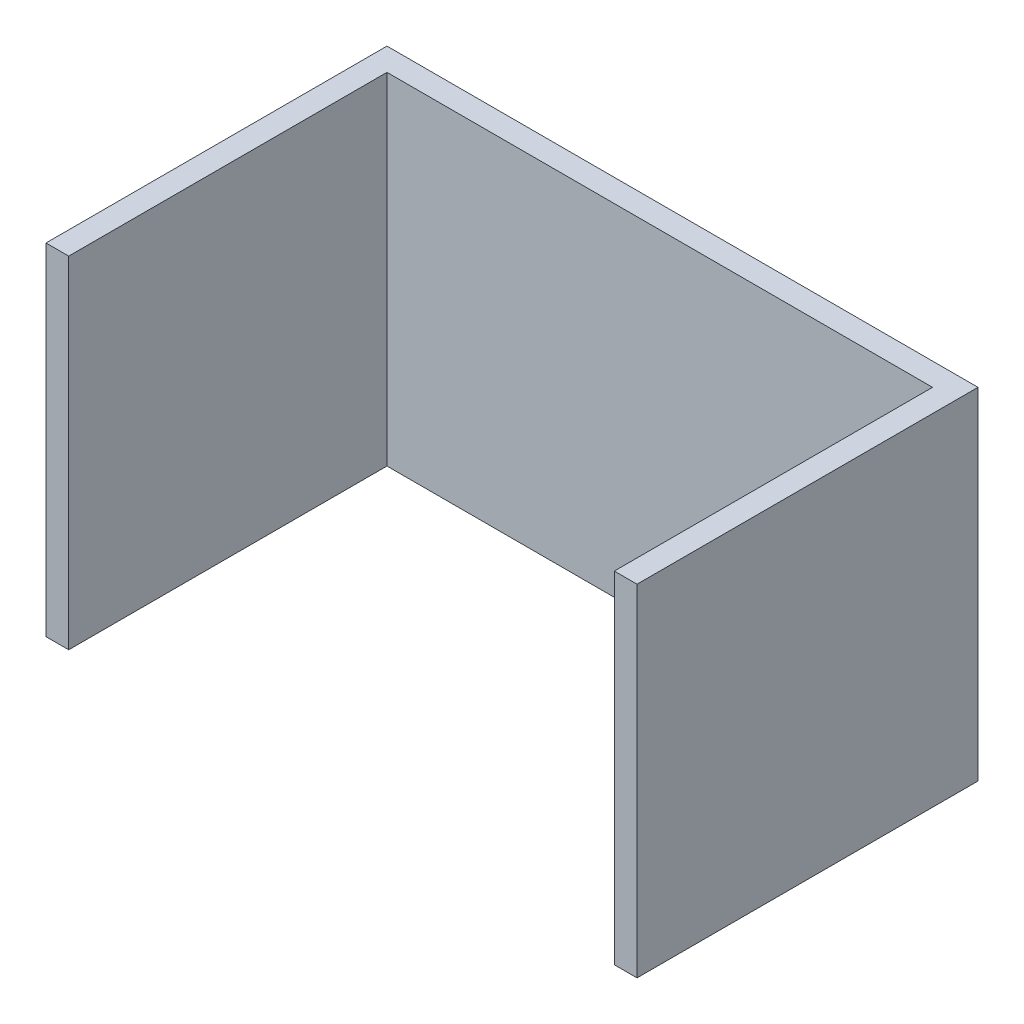
ISO-10303-21;
HEADER;
FILE_DESCRIPTION(('STEP AP214'),'2;1');
FILE_NAME('part.step','',(''),(''),'','','');
FILE_SCHEMA(('AUTOMOTIVE_DESIGN { 1 0 10303 214 1 1 1 1 }'));
ENDSEC;
DATA;
#1=APPLICATION_CONTEXT('core data for automotive mechanical design processes');
#2=APPLICATION_PROTOCOL_DEFINITION('international standard','automotive_design',2000,#1);
#3=PRODUCT_CONTEXT('',#1,'mechanical');
#4=PRODUCT('Part','Part','',(#3));
#5=PRODUCT_RELATED_PRODUCT_CATEGORY('part','',(#4));
#6=PRODUCT_DEFINITION_FORMATION('','',#4);
#7=PRODUCT_DEFINITION_CONTEXT('part definition',#1,'design');
#8=PRODUCT_DEFINITION('design','',#6,#7);
#9=PRODUCT_DEFINITION_SHAPE('','',#8);
#10=(LENGTH_UNIT() NAMED_UNIT(*) SI_UNIT(.MILLI.,.METRE.));
#11=(NAMED_UNIT(*) PLANE_ANGLE_UNIT() SI_UNIT($,.RADIAN.));
#12=(NAMED_UNIT(*) SI_UNIT($,.STERADIAN.) SOLID_ANGLE_UNIT());
#13=UNCERTAINTY_MEASURE_WITH_UNIT(LENGTH_MEASURE(1.E-05),#10,'distance_accuracy_value','');
#14=(GEOMETRIC_REPRESENTATION_CONTEXT(3) GLOBAL_UNCERTAINTY_ASSIGNED_CONTEXT((#13)) GLOBAL_UNIT_ASSIGNED_CONTEXT((#10,
#11,#12)) REPRESENTATION_CONTEXT('',''));
#15=CARTESIAN_POINT('',(0.,0.,0.));
#16=DIRECTION('',(0.,0.,1.));
#17=DIRECTION('',(1.,0.,0.));
#18=AXIS2_PLACEMENT_3D('',#15,#16,#17);
#19=CARTESIAN_POINT('',(-11.5778950959873,30.,1.40402715368116));
#20=DIRECTION('',(0.,0.,-1.));
#21=DIRECTION('',(-1.,0.,0.));
#22=AXIS2_PLACEMENT_3D('',#19,#20,#21);
#23=PLANE('',#22);
#24=DIRECTION('',(1.,0.,0.));
#25=VECTOR('',#24,1.);
#26=CARTESIAN_POINT('',(-11.5778950959873,0.,1.40402715368116));
#27=LINE('',#26,#25);
#28=CARTESIAN_POINT('',(-11.5778950959873,0.,1.40402715368116));
#29=VERTEX_POINT('',#28);
#30=CARTESIAN_POINT('',(-9.57789509598727,0.,1.40402715368116));
#31=VERTEX_POINT('',#30);
#32=EDGE_CURVE('E167',#29,#31,#27,.T.);
#33=ORIENTED_EDGE('',*,*,#32,.T.);
#34=DIRECTION('',(0.,1.,0.));
#35=VECTOR('',#34,1.);
#36=CARTESIAN_POINT('',(-9.57789509598727,30.,1.40402715368116));
#37=LINE('',#36,#35);
#38=CARTESIAN_POINT('',(-9.57789509598727,30.,1.40402715368116));
#39=VERTEX_POINT('',#38);
#40=EDGE_CURVE('E147',#31,#39,#37,.T.);
#41=ORIENTED_EDGE('',*,*,#40,.T.);
#42=DIRECTION('',(1.,0.,0.));
#43=VECTOR('',#42,1.);
#44=CARTESIAN_POINT('',(-11.5778950959873,30.,1.40402715368116));
#45=LINE('',#44,#43);
#46=CARTESIAN_POINT('',(-11.5778950959873,30.,1.40402715368116));
#47=VERTEX_POINT('',#46);
#48=EDGE_CURVE('E98',#47,#39,#45,.T.);
#49=ORIENTED_EDGE('',*,*,#48,.F.);
#50=DIRECTION('',(0.,-1.,0.));
#51=VECTOR('',#50,1.);
#52=CARTESIAN_POINT('',(-11.5778950959873,30.,1.40402715368116));
#53=LINE('',#52,#51);
#54=EDGE_CURVE('E185',#47,#29,#53,.T.);
#55=ORIENTED_EDGE('',*,*,#54,.T.);
#56=EDGE_LOOP('',(#33,#41,#49,#55));
#57=FACE_BOUND('',#56,.T.);
#58=ADVANCED_FACE('F44',(#57),#23,.F.);
#59=CARTESIAN_POINT('',(-11.5778950959873,30.,1.40402715368116));
#60=DIRECTION('',(1.,0.,0.));
#61=DIRECTION('',(0.,0.,-1.));
#62=AXIS2_PLACEMENT_3D('',#59,#60,#61);
#63=PLANE('',#62);
#64=DIRECTION('',(0.,0.,1.));
#65=VECTOR('',#64,1.);
#66=CARTESIAN_POINT('',(-11.5778950959873,0.,1.40402715368116));
#67=LINE('',#66,#65);
#68=CARTESIAN_POINT('',(-11.5778950959873,0.,-28.5959728463188));
#69=VERTEX_POINT('',#68);
#70=EDGE_CURVE('E150',#69,#29,#67,.T.);
#71=ORIENTED_EDGE('',*,*,#70,.T.);
#72=ORIENTED_EDGE('',*,*,#54,.F.);
#73=DIRECTION('',(0.,0.,1.));
#74=VECTOR('',#73,1.);
#75=CARTESIAN_POINT('',(-11.5778950959873,30.,1.40402715368116));
#76=LINE('',#75,#74);
#77=CARTESIAN_POINT('',(-11.5778950959873,30.,-28.5959728463188));
#78=VERTEX_POINT('',#77);
#79=EDGE_CURVE('E151',#78,#47,#76,.T.);
#80=ORIENTED_EDGE('',*,*,#79,.F.);
#81=DIRECTION('',(0.,-1.,0.));
#82=VECTOR('',#81,1.);
#83=CARTESIAN_POINT('',(-11.5778950959873,30.,-28.5959728463188));
#84=LINE('',#83,#82);
#85=EDGE_CURVE('E162',#78,#69,#84,.T.);
#86=ORIENTED_EDGE('',*,*,#85,.T.);
#87=EDGE_LOOP('',(#71,#72,#80,#86));
#88=FACE_BOUND('',#87,.T.);
#89=ADVANCED_FACE('F46',(#88),#63,.F.);
#90=CARTESIAN_POINT('',(38.4221049040127,30.,1.40402715368116));
#91=VERTEX_POINT('',#90);
#92=CARTESIAN_POINT('',(40.4221049040127,30.,1.40402715368116));
#93=VERTEX_POINT('',#92);
#94=EDGE_CURVE('E154',#91,#93,#45,.T.);
#95=ORIENTED_EDGE('',*,*,#94,.F.);
#96=DIRECTION('',(0.,-1.,0.));
#97=VECTOR('',#96,1.);
#98=CARTESIAN_POINT('',(38.4221049040127,30.,1.40402715368116));
#99=LINE('',#98,#97);
#100=CARTESIAN_POINT('',(38.4221049040127,0.,1.40402715368116));
#101=VERTEX_POINT('',#100);
#102=EDGE_CURVE('E133',#91,#101,#99,.T.);
#103=ORIENTED_EDGE('',*,*,#102,.T.);
#104=CARTESIAN_POINT('',(40.4221049040127,0.,1.40402715368116));
#105=VERTEX_POINT('',#104);
#106=EDGE_CURVE('E166',#101,#105,#27,.T.);
#107=ORIENTED_EDGE('',*,*,#106,.T.);
#108=DIRECTION('',(0.,-1.,0.));
#109=VECTOR('',#108,1.);
#110=CARTESIAN_POINT('',(40.4221049040127,30.,1.40402715368116));
#111=LINE('',#110,#109);
#112=EDGE_CURVE('E181',#93,#105,#111,.T.);
#113=ORIENTED_EDGE('',*,*,#112,.F.);
#114=EDGE_LOOP('',(#95,#103,#107,#113));
#115=FACE_BOUND('',#114,.T.);
#116=ADVANCED_FACE('F196',(#115),#23,.F.);
#117=CARTESIAN_POINT('',(40.4221049040127,30.,1.40402715368116));
#118=DIRECTION('',(-1.,0.,0.));
#119=DIRECTION('',(0.,0.,1.));
#120=AXIS2_PLACEMENT_3D('',#117,#118,#119);
#121=PLANE('',#120);
#122=DIRECTION('',(0.,0.,-1.));
#123=VECTOR('',#122,1.);
#124=CARTESIAN_POINT('',(40.4221049040127,0.,1.40402715368116));
#125=LINE('',#124,#123);
#126=CARTESIAN_POINT('',(40.4221049040127,0.,-28.5959728463188));
#127=VERTEX_POINT('',#126);
#128=EDGE_CURVE('E171',#105,#127,#125,.T.);
#129=ORIENTED_EDGE('',*,*,#128,.T.);
#130=DIRECTION('',(0.,-1.,0.));
#131=VECTOR('',#130,1.);
#132=CARTESIAN_POINT('',(40.4221049040127,30.,-28.5959728463188));
#133=LINE('',#132,#131);
#134=CARTESIAN_POINT('',(40.4221049040127,30.,-28.5959728463188));
#135=VERTEX_POINT('',#134);
#136=EDGE_CURVE('E178',#135,#127,#133,.T.);
#137=ORIENTED_EDGE('',*,*,#136,.F.);
#138=DIRECTION('',(0.,0.,-1.));
#139=VECTOR('',#138,1.);
#140=CARTESIAN_POINT('',(40.4221049040127,30.,1.40402715368116));
#141=LINE('',#140,#139);
#142=EDGE_CURVE('E157',#93,#135,#141,.T.);
#143=ORIENTED_EDGE('',*,*,#142,.F.);
#144=ORIENTED_EDGE('',*,*,#112,.T.);
#145=EDGE_LOOP('',(#129,#137,#143,#144));
#146=FACE_BOUND('',#145,.T.);
#147=ADVANCED_FACE('F201',(#146),#121,.F.);
#148=CARTESIAN_POINT('',(-11.5778950959873,30.,-28.5959728463188));
#149=DIRECTION('',(0.,0.,1.));
#150=DIRECTION('',(1.,0.,0.));
#151=AXIS2_PLACEMENT_3D('',#148,#149,#150);
#152=PLANE('',#151);
#153=DIRECTION('',(-1.,0.,0.));
#154=VECTOR('',#153,1.);
#155=CARTESIAN_POINT('',(-11.5778950959873,0.,-28.5959728463188));
#156=LINE('',#155,#154);
#157=EDGE_CURVE('E90',#127,#69,#156,.T.);
#158=ORIENTED_EDGE('',*,*,#157,.T.);
#159=ORIENTED_EDGE('',*,*,#85,.F.);
#160=DIRECTION('',(-1.,0.,0.));
#161=VECTOR('',#160,1.);
#162=CARTESIAN_POINT('',(-11.5778950959873,30.,-28.5959728463188));
#163=LINE('',#162,#161);
#164=EDGE_CURVE('E69',#135,#78,#163,.T.);
#165=ORIENTED_EDGE('',*,*,#164,.F.);
#166=ORIENTED_EDGE('',*,*,#136,.T.);
#167=EDGE_LOOP('',(#158,#159,#165,#166));
#168=FACE_BOUND('',#167,.T.);
#169=ADVANCED_FACE('F209',(#168),#152,.F.);
#170=CARTESIAN_POINT('',(0.,30.,0.));
#171=DIRECTION('',(0.,-1.,0.));
#172=DIRECTION('',(0.,0.,-1.));
#173=AXIS2_PLACEMENT_3D('',#170,#171,#172);
#174=PLANE('',#173);
#175=ORIENTED_EDGE('',*,*,#48,.T.);
#176=DIRECTION('',(0.,0.,1.));
#177=VECTOR('',#176,1.);
#178=CARTESIAN_POINT('',(-9.57789509598727,30.,-26.5959728463188));
#179=LINE('',#178,#177);
#180=CARTESIAN_POINT('',(-9.57789509598727,30.,-26.5959728463188));
#181=VERTEX_POINT('',#180);
#182=EDGE_CURVE('E136',#181,#39,#179,.T.);
#183=ORIENTED_EDGE('',*,*,#182,.F.);
#184=DIRECTION('',(-1.,0.,0.));
#185=VECTOR('',#184,1.);
#186=CARTESIAN_POINT('',(-9.57789509598727,30.,-26.5959728463188));
#187=LINE('',#186,#185);
#188=CARTESIAN_POINT('',(38.4221049040127,30.,-26.5959728463188));
#189=VERTEX_POINT('',#188);
#190=EDGE_CURVE('E122',#189,#181,#187,.T.);
#191=ORIENTED_EDGE('',*,*,#190,.F.);
#192=DIRECTION('',(0.,0.,-1.));
#193=VECTOR('',#192,1.);
#194=CARTESIAN_POINT('',(38.4221049040127,30.,-26.5959728463188));
#195=LINE('',#194,#193);
#196=EDGE_CURVE('E130',#91,#189,#195,.T.);
#197=ORIENTED_EDGE('',*,*,#196,.F.);
#198=ORIENTED_EDGE('',*,*,#94,.T.);
#199=ORIENTED_EDGE('',*,*,#142,.T.);
#200=ORIENTED_EDGE('',*,*,#164,.T.);
#201=ORIENTED_EDGE('',*,*,#79,.T.);
#202=EDGE_LOOP('',(#175,#183,#191,#197,#198,#199,#200,#201));
#203=FACE_BOUND('',#202,.T.);
#204=ADVANCED_FACE('F138',(#203),#174,.F.);
#205=CARTESIAN_POINT('',(0.,0.,0.));
#206=DIRECTION('',(0.,-1.,0.));
#207=DIRECTION('',(0.,0.,-1.));
#208=AXIS2_PLACEMENT_3D('',#205,#206,#207);
#209=PLANE('',#208);
#210=DIRECTION('',(0.,0.,-1.));
#211=VECTOR('',#210,1.);
#212=CARTESIAN_POINT('',(-9.57789509598727,0.,0.));
#213=LINE('',#212,#211);
#214=CARTESIAN_POINT('',(-9.57789509598727,0.,-26.5959728463188));
#215=VERTEX_POINT('',#214);
#216=EDGE_CURVE('E11',#31,#215,#213,.T.);
#217=ORIENTED_EDGE('',*,*,#216,.F.);
#218=ORIENTED_EDGE('',*,*,#32,.F.);
#219=ORIENTED_EDGE('',*,*,#70,.F.);
#220=ORIENTED_EDGE('',*,*,#157,.F.);
#221=ORIENTED_EDGE('',*,*,#128,.F.);
#222=ORIENTED_EDGE('',*,*,#106,.F.);
#223=DIRECTION('',(0.,0.,1.));
#224=VECTOR('',#223,1.);
#225=CARTESIAN_POINT('',(38.4221049040127,0.,0.));
#226=LINE('',#225,#224);
#227=CARTESIAN_POINT('',(38.4221049040127,0.,-26.5959728463188));
#228=VERTEX_POINT('',#227);
#229=EDGE_CURVE('E188',#228,#101,#226,.T.);
#230=ORIENTED_EDGE('',*,*,#229,.F.);
#231=DIRECTION('',(1.,0.,0.));
#232=VECTOR('',#231,1.);
#233=CARTESIAN_POINT('',(0.,0.,-26.5959728463188));
#234=LINE('',#233,#232);
#235=EDGE_CURVE('E53',#215,#228,#234,.T.);
#236=ORIENTED_EDGE('',*,*,#235,.F.);
#237=EDGE_LOOP('',(#217,#218,#219,#220,#221,#222,#230,#236));
#238=FACE_BOUND('',#237,.T.);
#239=ADVANCED_FACE('F204',(#238),#209,.T.);
#240=CARTESIAN_POINT('',(-9.57789509598727,-17.,-26.5959728463188));
#241=DIRECTION('',(-1.,0.,0.));
#242=DIRECTION('',(0.,0.,1.));
#243=AXIS2_PLACEMENT_3D('',#240,#241,#242);
#244=PLANE('',#243);
#245=ORIENTED_EDGE('',*,*,#216,.T.);
#246=DIRECTION('',(0.,1.,0.));
#247=VECTOR('',#246,1.);
#248=CARTESIAN_POINT('',(-9.57789509598727,-17.,-26.5959728463188));
#249=LINE('',#248,#247);
#250=EDGE_CURVE('E127',#215,#181,#249,.T.);
#251=ORIENTED_EDGE('',*,*,#250,.T.);
#252=ORIENTED_EDGE('',*,*,#182,.T.);
#253=ORIENTED_EDGE('',*,*,#40,.F.);
#254=EDGE_LOOP('',(#245,#251,#252,#253));
#255=FACE_BOUND('',#254,.T.);
#256=ADVANCED_FACE('F240',(#255),#244,.F.);
#257=CARTESIAN_POINT('',(38.4221049040127,-17.,-26.5959728463188));
#258=DIRECTION('',(1.,0.,0.));
#259=DIRECTION('',(0.,0.,-1.));
#260=AXIS2_PLACEMENT_3D('',#257,#258,#259);
#261=PLANE('',#260);
#262=ORIENTED_EDGE('',*,*,#196,.T.);
#263=DIRECTION('',(0.,1.,0.));
#264=VECTOR('',#263,1.);
#265=CARTESIAN_POINT('',(38.4221049040127,-17.,-26.5959728463188));
#266=LINE('',#265,#264);
#267=EDGE_CURVE('E60',#228,#189,#266,.T.);
#268=ORIENTED_EDGE('',*,*,#267,.F.);
#269=ORIENTED_EDGE('',*,*,#229,.T.);
#270=ORIENTED_EDGE('',*,*,#102,.F.);
#271=EDGE_LOOP('',(#262,#268,#269,#270));
#272=FACE_BOUND('',#271,.T.);
#273=ADVANCED_FACE('F131',(#272),#261,.F.);
#274=CARTESIAN_POINT('',(-9.57789509598727,-17.,-26.5959728463188));
#275=DIRECTION('',(0.,0.,-1.));
#276=DIRECTION('',(-1.,0.,0.));
#277=AXIS2_PLACEMENT_3D('',#274,#275,#276);
#278=PLANE('',#277);
#279=ORIENTED_EDGE('',*,*,#235,.T.);
#280=ORIENTED_EDGE('',*,*,#267,.T.);
#281=ORIENTED_EDGE('',*,*,#190,.T.);
#282=ORIENTED_EDGE('',*,*,#250,.F.);
#283=EDGE_LOOP('',(#279,#280,#281,#282));
#284=FACE_BOUND('',#283,.T.);
#285=ADVANCED_FACE('F119',(#284),#278,.F.);
#286=CLOSED_SHELL('',(#58,#89,#116,#147,#169,#204,#239,#256,#273,#285));
#287=MANIFOLD_SOLID_BREP('B2',#286);
#288=ADVANCED_BREP_SHAPE_REPRESENTATION('',(#18,#287),#14);
#289=SHAPE_DEFINITION_REPRESENTATION(#9,#288);
ENDSEC;
END-ISO-10303-21;
